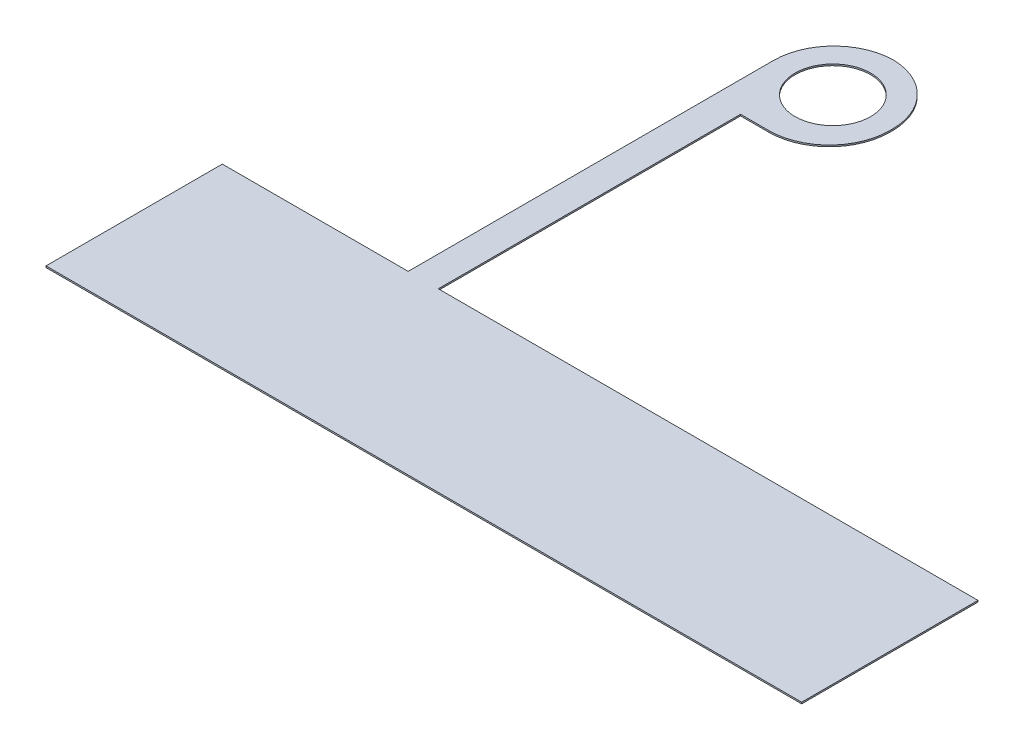
ISO-10303-21;
HEADER;
FILE_DESCRIPTION(('STEP AP214'),'2;1');
FILE_NAME('part.step','',(''),(''),'','','');
FILE_SCHEMA(('AUTOMOTIVE_DESIGN { 1 0 10303 214 1 1 1 1 }'));
ENDSEC;
DATA;
#1=APPLICATION_CONTEXT('core data for automotive mechanical design processes');
#2=APPLICATION_PROTOCOL_DEFINITION('international standard','automotive_design',2000,#1);
#3=PRODUCT_CONTEXT('',#1,'mechanical');
#4=PRODUCT('Part','Part','',(#3));
#5=PRODUCT_RELATED_PRODUCT_CATEGORY('part','',(#4));
#6=PRODUCT_DEFINITION_FORMATION('','',#4);
#7=PRODUCT_DEFINITION_CONTEXT('part definition',#1,'design');
#8=PRODUCT_DEFINITION('design','',#6,#7);
#9=PRODUCT_DEFINITION_SHAPE('','',#8);
#10=(LENGTH_UNIT() NAMED_UNIT(*) SI_UNIT(.MILLI.,.METRE.));
#11=(NAMED_UNIT(*) PLANE_ANGLE_UNIT() SI_UNIT($,.RADIAN.));
#12=(NAMED_UNIT(*) SI_UNIT($,.STERADIAN.) SOLID_ANGLE_UNIT());
#13=UNCERTAINTY_MEASURE_WITH_UNIT(LENGTH_MEASURE(1.E-05),#10,'distance_accuracy_value','');
#14=(GEOMETRIC_REPRESENTATION_CONTEXT(3) GLOBAL_UNCERTAINTY_ASSIGNED_CONTEXT((#13)) GLOBAL_UNIT_ASSIGNED_CONTEXT((#10,
#11,#12)) REPRESENTATION_CONTEXT('',''));
#15=CARTESIAN_POINT('',(0.,0.,0.));
#16=DIRECTION('',(0.,0.,1.));
#17=DIRECTION('',(1.,0.,0.));
#18=AXIS2_PLACEMENT_3D('',#15,#16,#17);
#19=CARTESIAN_POINT('',(0.,0.03,0.));
#20=DIRECTION('',(0.,0.,-1.));
#21=DIRECTION('',(-1.,0.,0.));
#22=AXIS2_PLACEMENT_3D('',#19,#20,#21);
#23=PLANE('',#22);
#24=DIRECTION('',(1.,0.,0.));
#25=VECTOR('',#24,1.);
#26=CARTESIAN_POINT('',(0.,0.,0.));
#27=LINE('',#26,#25);
#28=CARTESIAN_POINT('',(0.,0.,0.));
#29=VERTEX_POINT('',#28);
#30=CARTESIAN_POINT('',(15.,0.,0.));
#31=VERTEX_POINT('',#30);
#32=EDGE_CURVE('E163',#29,#31,#27,.T.);
#33=ORIENTED_EDGE('',*,*,#32,.T.);
#34=DIRECTION('',(0.,-1.,0.));
#35=VECTOR('',#34,1.);
#36=CARTESIAN_POINT('',(15.,0.03,0.));
#37=LINE('',#36,#35);
#38=CARTESIAN_POINT('',(15.,0.03,0.));
#39=VERTEX_POINT('',#38);
#40=EDGE_CURVE('E142',#39,#31,#37,.T.);
#41=ORIENTED_EDGE('',*,*,#40,.F.);
#42=DIRECTION('',(1.,0.,0.));
#43=VECTOR('',#42,1.);
#44=CARTESIAN_POINT('',(0.,0.03,0.));
#45=LINE('',#44,#43);
#46=CARTESIAN_POINT('',(0.,0.03,0.));
#47=VERTEX_POINT('',#46);
#48=EDGE_CURVE('E149',#47,#39,#45,.T.);
#49=ORIENTED_EDGE('',*,*,#48,.F.);
#50=DIRECTION('',(0.,-1.,0.));
#51=VECTOR('',#50,1.);
#52=CARTESIAN_POINT('',(0.,0.03,0.));
#53=LINE('',#52,#51);
#54=EDGE_CURVE('E242',#47,#29,#53,.T.);
#55=ORIENTED_EDGE('',*,*,#54,.T.);
#56=EDGE_LOOP('',(#33,#41,#49,#55));
#57=FACE_BOUND('',#56,.T.);
#58=ADVANCED_FACE('F45',(#57),#23,.F.);
#59=CARTESIAN_POINT('',(15.,0.03,0.));
#60=DIRECTION('',(-1.,0.,0.));
#61=DIRECTION('',(0.,0.,1.));
#62=AXIS2_PLACEMENT_3D('',#59,#60,#61);
#63=PLANE('',#62);
#64=DIRECTION('',(0.,0.,-1.));
#65=VECTOR('',#64,1.);
#66=CARTESIAN_POINT('',(15.,0.,0.));
#67=LINE('',#66,#65);
#68=CARTESIAN_POINT('',(15.,0.,-3.5));
#69=VERTEX_POINT('',#68);
#70=EDGE_CURVE('E262',#31,#69,#67,.T.);
#71=ORIENTED_EDGE('',*,*,#70,.T.);
#72=DIRECTION('',(0.,-1.,0.));
#73=VECTOR('',#72,1.);
#74=CARTESIAN_POINT('',(15.,0.03,-3.5));
#75=LINE('',#74,#73);
#76=CARTESIAN_POINT('',(15.,0.03,-3.5));
#77=VERTEX_POINT('',#76);
#78=EDGE_CURVE('E144',#77,#69,#75,.T.);
#79=ORIENTED_EDGE('',*,*,#78,.F.);
#80=DIRECTION('',(0.,0.,-1.));
#81=VECTOR('',#80,1.);
#82=CARTESIAN_POINT('',(15.,0.03,0.));
#83=LINE('',#82,#81);
#84=EDGE_CURVE('E137',#39,#77,#83,.T.);
#85=ORIENTED_EDGE('',*,*,#84,.F.);
#86=ORIENTED_EDGE('',*,*,#40,.T.);
#87=EDGE_LOOP('',(#71,#79,#85,#86));
#88=FACE_BOUND('',#87,.T.);
#89=ADVANCED_FACE('F140',(#88),#63,.F.);
#90=CARTESIAN_POINT('',(0.,0.03,-3.5));
#91=DIRECTION('',(0.,0.,-1.));
#92=DIRECTION('',(-1.,0.,0.));
#93=AXIS2_PLACEMENT_3D('',#90,#91,#92);
#94=PLANE('',#93);
#95=DIRECTION('',(1.,0.,0.));
#96=VECTOR('',#95,1.);
#97=CARTESIAN_POINT('',(0.,0.,-3.5));
#98=LINE('',#97,#96);
#99=CARTESIAN_POINT('',(4.287,0.,-3.5));
#100=VERTEX_POINT('',#99);
#101=EDGE_CURVE('E231',#100,#69,#98,.T.);
#102=ORIENTED_EDGE('',*,*,#101,.F.);
#103=DIRECTION('',(0.,-1.,0.));
#104=VECTOR('',#103,1.);
#105=CARTESIAN_POINT('',(4.287,0.03,-3.5));
#106=LINE('',#105,#104);
#107=CARTESIAN_POINT('',(4.287,0.03,-3.5));
#108=VERTEX_POINT('',#107);
#109=EDGE_CURVE('E171',#108,#100,#106,.T.);
#110=ORIENTED_EDGE('',*,*,#109,.F.);
#111=DIRECTION('',(1.,0.,0.));
#112=VECTOR('',#111,1.);
#113=CARTESIAN_POINT('',(0.,0.03,-3.5));
#114=LINE('',#113,#112);
#115=EDGE_CURVE('E148',#108,#77,#114,.T.);
#116=ORIENTED_EDGE('',*,*,#115,.T.);
#117=ORIENTED_EDGE('',*,*,#78,.T.);
#118=EDGE_LOOP('',(#102,#110,#116,#117));
#119=FACE_BOUND('',#118,.T.);
#120=ADVANCED_FACE('F260',(#119),#94,.T.);
#121=CARTESIAN_POINT('',(4.287,0.03,0.));
#122=DIRECTION('',(-1.,0.,0.));
#123=DIRECTION('',(0.,0.,1.));
#124=AXIS2_PLACEMENT_3D('',#121,#122,#123);
#125=PLANE('',#124);
#126=DIRECTION('',(0.,0.,-1.));
#127=VECTOR('',#126,1.);
#128=CARTESIAN_POINT('',(4.287,0.,0.));
#129=LINE('',#128,#127);
#130=CARTESIAN_POINT('',(4.287,0.,-9.5));
#131=VERTEX_POINT('',#130);
#132=EDGE_CURVE('E225',#100,#131,#129,.T.);
#133=ORIENTED_EDGE('',*,*,#132,.T.);
#134=DIRECTION('',(0.,-1.,0.));
#135=VECTOR('',#134,1.);
#136=CARTESIAN_POINT('',(4.287,0.03,-9.5));
#137=LINE('',#136,#135);
#138=CARTESIAN_POINT('',(4.287,0.03,-9.5));
#139=VERTEX_POINT('',#138);
#140=EDGE_CURVE('E223',#139,#131,#137,.T.);
#141=ORIENTED_EDGE('',*,*,#140,.F.);
#142=DIRECTION('',(0.,0.,-1.));
#143=VECTOR('',#142,1.);
#144=CARTESIAN_POINT('',(4.287,0.03,0.));
#145=LINE('',#144,#143);
#146=EDGE_CURVE('E256',#108,#139,#145,.T.);
#147=ORIENTED_EDGE('',*,*,#146,.F.);
#148=ORIENTED_EDGE('',*,*,#109,.T.);
#149=EDGE_LOOP('',(#133,#141,#147,#148));
#150=FACE_BOUND('',#149,.T.);
#151=ADVANCED_FACE('F255',(#150),#125,.F.);
#152=CARTESIAN_POINT('',(0.,0.03,-9.5));
#153=DIRECTION('',(0.,0.,-1.));
#154=DIRECTION('',(-1.,0.,0.));
#155=AXIS2_PLACEMENT_3D('',#152,#153,#154);
#156=PLANE('',#155);
#157=DIRECTION('',(1.,0.,0.));
#158=VECTOR('',#157,1.);
#159=CARTESIAN_POINT('',(0.,0.,-9.5));
#160=LINE('',#159,#158);
#161=CARTESIAN_POINT('',(4.849,0.,-9.5));
#162=VERTEX_POINT('',#161);
#163=EDGE_CURVE('E217',#131,#162,#160,.T.);
#164=ORIENTED_EDGE('',*,*,#163,.T.);
#165=DIRECTION('',(0.,-1.,0.));
#166=VECTOR('',#165,1.);
#167=CARTESIAN_POINT('',(4.849,0.03,-9.5));
#168=LINE('',#167,#166);
#169=CARTESIAN_POINT('',(4.849,0.03,-9.5));
#170=VERTEX_POINT('',#169);
#171=EDGE_CURVE('E187',#162,#170,#168,.F.);
#172=ORIENTED_EDGE('',*,*,#171,.T.);
#173=DIRECTION('',(1.,0.,0.));
#174=VECTOR('',#173,1.);
#175=CARTESIAN_POINT('',(0.,0.03,-9.5));
#176=LINE('',#175,#174);
#177=EDGE_CURVE('E199',#139,#170,#176,.T.);
#178=ORIENTED_EDGE('',*,*,#177,.F.);
#179=ORIENTED_EDGE('',*,*,#140,.T.);
#180=EDGE_LOOP('',(#164,#172,#178,#179));
#181=FACE_BOUND('',#180,.T.);
#182=ADVANCED_FACE('F221',(#181),#156,.F.);
#183=CARTESIAN_POINT('',(6.049,0.03,0.));
#184=DIRECTION('',(-1.,0.,0.));
#185=DIRECTION('',(0.,0.,1.));
#186=AXIS2_PLACEMENT_3D('',#183,#184,#185);
#187=PLANE('',#186);
#188=DIRECTION('',(0.,0.,-1.));
#189=VECTOR('',#188,1.);
#190=CARTESIAN_POINT('',(6.049,0.03,0.));
#191=LINE('',#190,#189);
#192=CARTESIAN_POINT('',(6.049,0.03,-10.7));
#193=VERTEX_POINT('',#192);
#194=CARTESIAN_POINT('',(6.049,0.03,-10.75));
#195=VERTEX_POINT('',#194);
#196=EDGE_CURVE('E197',#193,#195,#191,.T.);
#197=ORIENTED_EDGE('',*,*,#196,.F.);
#198=DIRECTION('',(0.,-1.,0.));
#199=VECTOR('',#198,1.);
#200=CARTESIAN_POINT('',(6.049,0.03,-10.7));
#201=LINE('',#200,#199);
#202=CARTESIAN_POINT('',(6.049,0.,-10.7));
#203=VERTEX_POINT('',#202);
#204=EDGE_CURVE('E169',#193,#203,#201,.T.);
#205=ORIENTED_EDGE('',*,*,#204,.T.);
#206=DIRECTION('',(0.,0.,-1.));
#207=VECTOR('',#206,1.);
#208=CARTESIAN_POINT('',(6.049,0.,0.));
#209=LINE('',#208,#207);
#210=CARTESIAN_POINT('',(6.049,0.,-10.75));
#211=VERTEX_POINT('',#210);
#212=EDGE_CURVE('E218',#203,#211,#209,.T.);
#213=ORIENTED_EDGE('',*,*,#212,.T.);
#214=DIRECTION('',(0.,-1.,0.));
#215=VECTOR('',#214,1.);
#216=CARTESIAN_POINT('',(6.049,0.03,-10.75));
#217=LINE('',#216,#215);
#218=EDGE_CURVE('E165',#211,#195,#217,.F.);
#219=ORIENTED_EDGE('',*,*,#218,.T.);
#220=EDGE_LOOP('',(#197,#205,#213,#219));
#221=FACE_BOUND('',#220,.T.);
#222=ADVANCED_FACE('F204',(#221),#187,.F.);
#223=CARTESIAN_POINT('',(3.689,0.03,0.));
#224=DIRECTION('',(-1.,0.,0.));
#225=DIRECTION('',(0.,0.,1.));
#226=AXIS2_PLACEMENT_3D('',#223,#224,#225);
#227=PLANE('',#226);
#228=DIRECTION('',(0.,0.,-1.));
#229=VECTOR('',#228,1.);
#230=CARTESIAN_POINT('',(3.689,0.03,0.));
#231=LINE('',#230,#229);
#232=CARTESIAN_POINT('',(3.689,0.03,-3.5));
#233=VERTEX_POINT('',#232);
#234=CARTESIAN_POINT('',(3.689,0.03,-10.75));
#235=VERTEX_POINT('',#234);
#236=EDGE_CURVE('E209',#233,#235,#231,.T.);
#237=ORIENTED_EDGE('',*,*,#236,.T.);
#238=DIRECTION('',(0.,-1.,0.));
#239=VECTOR('',#238,1.);
#240=CARTESIAN_POINT('',(3.689,0.03,-10.75));
#241=LINE('',#240,#239);
#242=CARTESIAN_POINT('',(3.689,0.,-10.75));
#243=VERTEX_POINT('',#242);
#244=EDGE_CURVE('E11',#235,#243,#241,.T.);
#245=ORIENTED_EDGE('',*,*,#244,.T.);
#246=DIRECTION('',(0.,0.,-1.));
#247=VECTOR('',#246,1.);
#248=CARTESIAN_POINT('',(3.689,0.,0.));
#249=LINE('',#248,#247);
#250=CARTESIAN_POINT('',(3.689,0.,-3.5));
#251=VERTEX_POINT('',#250);
#252=EDGE_CURVE('E229',#251,#243,#249,.T.);
#253=ORIENTED_EDGE('',*,*,#252,.F.);
#254=DIRECTION('',(0.,-1.,0.));
#255=VECTOR('',#254,1.);
#256=CARTESIAN_POINT('',(3.689,0.03,-3.5));
#257=LINE('',#256,#255);
#258=EDGE_CURVE('E248',#233,#251,#257,.T.);
#259=ORIENTED_EDGE('',*,*,#258,.F.);
#260=EDGE_LOOP('',(#237,#245,#253,#259));
#261=FACE_BOUND('',#260,.T.);
#262=ADVANCED_FACE('F275',(#261),#227,.T.);
#263=CARTESIAN_POINT('',(0.,0.,-3.5));
#264=VERTEX_POINT('',#263);
#265=EDGE_CURVE('E238',#264,#251,#98,.T.);
#266=ORIENTED_EDGE('',*,*,#265,.F.);
#267=DIRECTION('',(0.,-1.,0.));
#268=VECTOR('',#267,1.);
#269=CARTESIAN_POINT('',(0.,0.03,-3.5));
#270=LINE('',#269,#268);
#271=CARTESIAN_POINT('',(0.,0.03,-3.5));
#272=VERTEX_POINT('',#271);
#273=EDGE_CURVE('E245',#272,#264,#270,.T.);
#274=ORIENTED_EDGE('',*,*,#273,.F.);
#275=EDGE_CURVE('E273',#272,#233,#114,.T.);
#276=ORIENTED_EDGE('',*,*,#275,.T.);
#277=ORIENTED_EDGE('',*,*,#258,.T.);
#278=EDGE_LOOP('',(#266,#274,#276,#277));
#279=FACE_BOUND('',#278,.T.);
#280=ADVANCED_FACE('F271',(#279),#94,.T.);
#281=CARTESIAN_POINT('',(0.,0.03,0.));
#282=DIRECTION('',(-1.,0.,0.));
#283=DIRECTION('',(0.,0.,1.));
#284=AXIS2_PLACEMENT_3D('',#281,#282,#283);
#285=PLANE('',#284);
#286=DIRECTION('',(0.,0.,-1.));
#287=VECTOR('',#286,1.);
#288=CARTESIAN_POINT('',(0.,0.,0.));
#289=LINE('',#288,#287);
#290=EDGE_CURVE('E160',#29,#264,#289,.T.);
#291=ORIENTED_EDGE('',*,*,#290,.F.);
#292=ORIENTED_EDGE('',*,*,#54,.F.);
#293=DIRECTION('',(0.,0.,-1.));
#294=VECTOR('',#293,1.);
#295=CARTESIAN_POINT('',(0.,0.03,0.));
#296=LINE('',#295,#294);
#297=EDGE_CURVE('E157',#47,#272,#296,.T.);
#298=ORIENTED_EDGE('',*,*,#297,.T.);
#299=ORIENTED_EDGE('',*,*,#273,.T.);
#300=EDGE_LOOP('',(#291,#292,#298,#299));
#301=FACE_BOUND('',#300,.T.);
#302=ADVANCED_FACE('F307',(#301),#285,.T.);
#303=CARTESIAN_POINT('',(0.,0.03,0.));
#304=DIRECTION('',(0.,1.,0.));
#305=DIRECTION('',(0.,0.,1.));
#306=AXIS2_PLACEMENT_3D('',#303,#304,#305);
#307=PLANE('',#306);
#308=CARTESIAN_POINT('',(4.869,0.03,-10.75));
#309=DIRECTION('',(0.,1.,0.));
#310=DIRECTION('',(0.,0.,1.));
#311=AXIS2_PLACEMENT_3D('',#308,#309,#310);
#312=CIRCLE('',#311,0.75);
#313=CARTESIAN_POINT('',(4.869,0.03,-10.));
#314=VERTEX_POINT('',#313);
#315=EDGE_CURVE('E283',#314,#314,#312,.T.);
#316=ORIENTED_EDGE('',*,*,#315,.F.);
#317=EDGE_LOOP('',(#316));
#318=FACE_BOUND('',#317,.T.);
#319=ORIENTED_EDGE('',*,*,#177,.T.);
#320=CARTESIAN_POINT('',(4.849,0.03,-10.7));
#321=DIRECTION('',(0.,1.,0.));
#322=DIRECTION('',(0.,0.,1.));
#323=AXIS2_PLACEMENT_3D('',#320,#321,#322);
#324=CIRCLE('',#323,1.2);
#325=EDGE_CURVE('E55',#170,#193,#324,.T.);
#326=ORIENTED_EDGE('',*,*,#325,.T.);
#327=ORIENTED_EDGE('',*,*,#196,.T.);
#328=CARTESIAN_POINT('',(4.849,0.03,-10.75));
#329=DIRECTION('',(0.,1.,0.));
#330=DIRECTION('',(0.,0.,1.));
#331=AXIS2_PLACEMENT_3D('',#328,#329,#330);
#332=CIRCLE('',#331,1.2);
#333=CARTESIAN_POINT('',(4.869,0.03,-11.9498333217577));
#334=VERTEX_POINT('',#333);
#335=EDGE_CURVE('E62',#195,#334,#332,.T.);
#336=ORIENTED_EDGE('',*,*,#335,.T.);
#337=CARTESIAN_POINT('',(4.889,0.03,-10.75));
#338=DIRECTION('',(0.,1.,0.));
#339=DIRECTION('',(0.,0.,1.));
#340=AXIS2_PLACEMENT_3D('',#337,#338,#339);
#341=CIRCLE('',#340,1.2);
#342=EDGE_CURVE('E67',#334,#235,#341,.T.);
#343=ORIENTED_EDGE('',*,*,#342,.T.);
#344=ORIENTED_EDGE('',*,*,#236,.F.);
#345=ORIENTED_EDGE('',*,*,#275,.F.);
#346=ORIENTED_EDGE('',*,*,#297,.F.);
#347=ORIENTED_EDGE('',*,*,#48,.T.);
#348=ORIENTED_EDGE('',*,*,#84,.T.);
#349=ORIENTED_EDGE('',*,*,#115,.F.);
#350=ORIENTED_EDGE('',*,*,#146,.T.);
#351=EDGE_LOOP('',(#319,#326,#327,#336,#343,#344,#345,#346,#347,#348,#349,#350));
#352=FACE_BOUND('',#351,.T.);
#353=ADVANCED_FACE('F154',(#318,#352),#307,.T.);
#354=CARTESIAN_POINT('',(0.,0.,0.));
#355=DIRECTION('',(0.,1.,0.));
#356=DIRECTION('',(0.,0.,1.));
#357=AXIS2_PLACEMENT_3D('',#354,#355,#356);
#358=PLANE('',#357);
#359=CARTESIAN_POINT('',(4.869,0.,-10.75));
#360=DIRECTION('',(0.,1.,0.));
#361=DIRECTION('',(0.,0.,1.));
#362=AXIS2_PLACEMENT_3D('',#359,#360,#361);
#363=CIRCLE('',#362,0.75);
#364=CARTESIAN_POINT('',(4.869,0.,-10.));
#365=VERTEX_POINT('',#364);
#366=EDGE_CURVE('E288',#365,#365,#363,.T.);
#367=ORIENTED_EDGE('',*,*,#366,.T.);
#368=EDGE_LOOP('',(#367));
#369=FACE_BOUND('',#368,.T.);
#370=ORIENTED_EDGE('',*,*,#212,.F.);
#371=CARTESIAN_POINT('',(4.849,0.,-10.7));
#372=DIRECTION('',(0.,1.,0.));
#373=DIRECTION('',(0.,0.,1.));
#374=AXIS2_PLACEMENT_3D('',#371,#372,#373);
#375=CIRCLE('',#374,1.2);
#376=EDGE_CURVE('E184',#203,#162,#375,.F.);
#377=ORIENTED_EDGE('',*,*,#376,.T.);
#378=ORIENTED_EDGE('',*,*,#163,.F.);
#379=ORIENTED_EDGE('',*,*,#132,.F.);
#380=ORIENTED_EDGE('',*,*,#101,.T.);
#381=ORIENTED_EDGE('',*,*,#70,.F.);
#382=ORIENTED_EDGE('',*,*,#32,.F.);
#383=ORIENTED_EDGE('',*,*,#290,.T.);
#384=ORIENTED_EDGE('',*,*,#265,.T.);
#385=ORIENTED_EDGE('',*,*,#252,.T.);
#386=CARTESIAN_POINT('',(4.889,0.,-10.75));
#387=DIRECTION('',(0.,1.,0.));
#388=DIRECTION('',(0.,0.,1.));
#389=AXIS2_PLACEMENT_3D('',#386,#387,#388);
#390=CIRCLE('',#389,1.2);
#391=CARTESIAN_POINT('',(4.869,0.,-11.9498333217577));
#392=VERTEX_POINT('',#391);
#393=EDGE_CURVE('E181',#243,#392,#390,.F.);
#394=ORIENTED_EDGE('',*,*,#393,.T.);
#395=CARTESIAN_POINT('',(4.849,0.,-10.75));
#396=DIRECTION('',(0.,1.,0.));
#397=DIRECTION('',(0.,0.,1.));
#398=AXIS2_PLACEMENT_3D('',#395,#396,#397);
#399=CIRCLE('',#398,1.2);
#400=EDGE_CURVE('E178',#392,#211,#399,.F.);
#401=ORIENTED_EDGE('',*,*,#400,.T.);
#402=EDGE_LOOP('',(#370,#377,#378,#379,#380,#381,#382,#383,#384,#385,#394,#401));
#403=FACE_BOUND('',#402,.T.);
#404=ADVANCED_FACE('F215',(#369,#403),#358,.F.);
#405=CARTESIAN_POINT('',(4.849,0.03,-10.7));
#406=DIRECTION('',(0.,-1.,0.));
#407=DIRECTION('',(0.,0.,-1.));
#408=AXIS2_PLACEMENT_3D('',#405,#406,#407);
#409=CYLINDRICAL_SURFACE('',#408,1.2);
#410=ORIENTED_EDGE('',*,*,#325,.F.);
#411=ORIENTED_EDGE('',*,*,#171,.F.);
#412=ORIENTED_EDGE('',*,*,#376,.F.);
#413=ORIENTED_EDGE('',*,*,#204,.F.);
#414=EDGE_LOOP('',(#410,#411,#412,#413));
#415=FACE_BOUND('',#414,.T.);
#416=ADVANCED_FACE('F211',(#415),#409,.T.);
#417=CARTESIAN_POINT('',(4.849,0.03,-10.75));
#418=DIRECTION('',(0.,1.,0.));
#419=DIRECTION('',(0.,0.,1.));
#420=AXIS2_PLACEMENT_3D('',#417,#418,#419);
#421=CYLINDRICAL_SURFACE('',#420,1.2);
#422=DIRECTION('',(0.,1.,0.));
#423=VECTOR('',#422,1.);
#424=CARTESIAN_POINT('',(4.869,0.015,-11.9498333217577));
#425=LINE('',#424,#423);
#426=EDGE_CURVE('E49',#334,#392,#425,.F.);
#427=ORIENTED_EDGE('',*,*,#426,.F.);
#428=ORIENTED_EDGE('',*,*,#335,.F.);
#429=ORIENTED_EDGE('',*,*,#218,.F.);
#430=ORIENTED_EDGE('',*,*,#400,.F.);
#431=EDGE_LOOP('',(#427,#428,#429,#430));
#432=FACE_BOUND('',#431,.T.);
#433=ADVANCED_FACE('F47',(#432),#421,.T.);
#434=CARTESIAN_POINT('',(4.889,0.03,-10.75));
#435=DIRECTION('',(0.,-1.,0.));
#436=DIRECTION('',(0.,0.,-1.));
#437=AXIS2_PLACEMENT_3D('',#434,#435,#436);
#438=CYLINDRICAL_SURFACE('',#437,1.2);
#439=ORIENTED_EDGE('',*,*,#342,.F.);
#440=ORIENTED_EDGE('',*,*,#426,.T.);
#441=ORIENTED_EDGE('',*,*,#393,.F.);
#442=ORIENTED_EDGE('',*,*,#244,.F.);
#443=EDGE_LOOP('',(#439,#440,#441,#442));
#444=FACE_BOUND('',#443,.T.);
#445=ADVANCED_FACE('F278',(#444),#438,.T.);
#446=CARTESIAN_POINT('',(4.869,0.,-10.75));
#447=DIRECTION('',(0.,1.,0.));
#448=DIRECTION('',(0.,0.,1.));
#449=AXIS2_PLACEMENT_3D('',#446,#447,#448);
#450=CYLINDRICAL_SURFACE('',#449,0.75);
#451=ORIENTED_EDGE('',*,*,#315,.T.);
#452=EDGE_LOOP('',(#451));
#453=FACE_BOUND('',#452,.T.);
#454=ORIENTED_EDGE('',*,*,#366,.F.);
#455=EDGE_LOOP('',(#454));
#456=FACE_BOUND('',#455,.T.);
#457=ADVANCED_FACE('F328',(#453,#456),#450,.F.);
#458=CLOSED_SHELL('',(#58,#89,#120,#151,#182,#222,#262,#280,#302,#353,#404,#416,#433,#445,#457));
#459=MANIFOLD_SOLID_BREP('B2',#458);
#460=ADVANCED_BREP_SHAPE_REPRESENTATION('',(#18,#459),#14);
#461=SHAPE_DEFINITION_REPRESENTATION(#9,#460);
ENDSEC;
END-ISO-10303-21;
